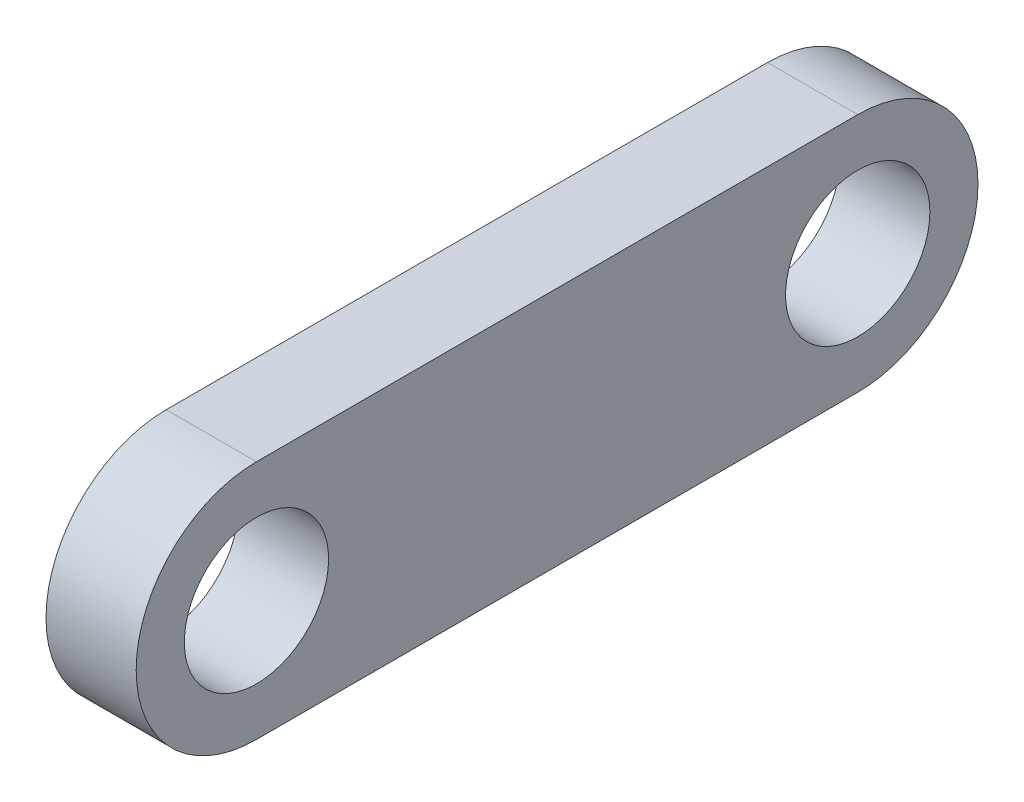
ISO-10303-21;
HEADER;
FILE_DESCRIPTION(('STEP AP214'),'2;1');
FILE_NAME('part.step','',(''),(''),'','','');
FILE_SCHEMA(('AUTOMOTIVE_DESIGN { 1 0 10303 214 1 1 1 1 }'));
ENDSEC;
DATA;
#1=APPLICATION_CONTEXT('core data for automotive mechanical design processes');
#2=APPLICATION_PROTOCOL_DEFINITION('international standard','automotive_design',2000,#1);
#3=PRODUCT_CONTEXT('',#1,'mechanical');
#4=PRODUCT('Part','Part','',(#3));
#5=PRODUCT_RELATED_PRODUCT_CATEGORY('part','',(#4));
#6=PRODUCT_DEFINITION_FORMATION('','',#4);
#7=PRODUCT_DEFINITION_CONTEXT('part definition',#1,'design');
#8=PRODUCT_DEFINITION('design','',#6,#7);
#9=PRODUCT_DEFINITION_SHAPE('','',#8);
#10=(LENGTH_UNIT() NAMED_UNIT(*) SI_UNIT(.MILLI.,.METRE.));
#11=(NAMED_UNIT(*) PLANE_ANGLE_UNIT() SI_UNIT($,.RADIAN.));
#12=(NAMED_UNIT(*) SI_UNIT($,.STERADIAN.) SOLID_ANGLE_UNIT());
#13=UNCERTAINTY_MEASURE_WITH_UNIT(LENGTH_MEASURE(1.E-05),#10,'distance_accuracy_value','');
#14=(GEOMETRIC_REPRESENTATION_CONTEXT(3) GLOBAL_UNCERTAINTY_ASSIGNED_CONTEXT((#13)) GLOBAL_UNIT_ASSIGNED_CONTEXT((#10,
#11,#12)) REPRESENTATION_CONTEXT('',''));
#15=CARTESIAN_POINT('',(0.,0.,0.));
#16=DIRECTION('',(0.,0.,1.));
#17=DIRECTION('',(1.,0.,0.));
#18=AXIS2_PLACEMENT_3D('',#15,#16,#17);
#19=CARTESIAN_POINT('',(-768.375,-128.224072417712,355.133501715319));
#20=DIRECTION('',(1.,0.,0.));
#21=DIRECTION('',(0.,0.,-1.));
#22=AXIS2_PLACEMENT_3D('',#19,#20,#21);
#23=CYLINDRICAL_SURFACE('',#22,20.);
#24=CARTESIAN_POINT('',(-753.375,-128.224072417712,355.133501715319));
#25=DIRECTION('',(1.,0.,0.));
#26=DIRECTION('',(0.,0.,-1.));
#27=AXIS2_PLACEMENT_3D('',#24,#25,#26);
#28=CIRCLE('',#27,20.);
#29=CARTESIAN_POINT('',(-753.375,-108.224072417712,355.133501715319));
#30=VERTEX_POINT('',#29);
#31=CARTESIAN_POINT('',(-753.375,-148.224072417712,355.133501715319));
#32=VERTEX_POINT('',#31);
#33=EDGE_CURVE('E104',#30,#32,#28,.T.);
#34=ORIENTED_EDGE('',*,*,#33,.F.);
#35=DIRECTION('',(1.,0.,0.));
#36=VECTOR('',#35,1.);
#37=CARTESIAN_POINT('',(-768.375,-108.224072417712,355.133501715319));
#38=LINE('',#37,#36);
#39=CARTESIAN_POINT('',(-768.375,-108.224072417712,355.133501715319));
#40=VERTEX_POINT('',#39);
#41=EDGE_CURVE('E11',#40,#30,#38,.T.);
#42=ORIENTED_EDGE('',*,*,#41,.F.);
#43=CARTESIAN_POINT('',(-768.375,-128.224072417712,355.133501715319));
#44=DIRECTION('',(1.,0.,0.));
#45=DIRECTION('',(0.,0.,-1.));
#46=AXIS2_PLACEMENT_3D('',#43,#44,#45);
#47=CIRCLE('',#46,20.);
#48=CARTESIAN_POINT('',(-768.375,-148.224072417712,355.133501715319));
#49=VERTEX_POINT('',#48);
#50=EDGE_CURVE('E97',#40,#49,#47,.T.);
#51=ORIENTED_EDGE('',*,*,#50,.T.);
#52=DIRECTION('',(1.,0.,0.));
#53=VECTOR('',#52,1.);
#54=CARTESIAN_POINT('',(-768.375,-148.224072417712,355.133501715319));
#55=LINE('',#54,#53);
#56=EDGE_CURVE('E42',#49,#32,#55,.T.);
#57=ORIENTED_EDGE('',*,*,#56,.T.);
#58=EDGE_LOOP('',(#34,#42,#51,#57));
#59=FACE_BOUND('',#58,.T.);
#60=ADVANCED_FACE('F39',(#59),#23,.T.);
#61=CARTESIAN_POINT('',(-768.375,-108.224072417712,355.133501715319));
#62=DIRECTION('',(0.,1.,0.));
#63=DIRECTION('',(0.,0.,1.));
#64=AXIS2_PLACEMENT_3D('',#61,#62,#63);
#65=PLANE('',#64);
#66=DIRECTION('',(0.,0.,1.));
#67=VECTOR('',#66,1.);
#68=CARTESIAN_POINT('',(-753.375,-108.224072417712,355.133501715319));
#69=LINE('',#68,#67);
#70=CARTESIAN_POINT('',(-753.375,-108.224072417712,255.133501715319));
#71=VERTEX_POINT('',#70);
#72=EDGE_CURVE('E99',#71,#30,#69,.T.);
#73=ORIENTED_EDGE('',*,*,#72,.F.);
#74=DIRECTION('',(1.,0.,0.));
#75=VECTOR('',#74,1.);
#76=CARTESIAN_POINT('',(-768.375,-108.224072417712,255.133501715319));
#77=LINE('',#76,#75);
#78=CARTESIAN_POINT('',(-768.375,-108.224072417712,255.133501715319));
#79=VERTEX_POINT('',#78);
#80=EDGE_CURVE('E48',#79,#71,#77,.T.);
#81=ORIENTED_EDGE('',*,*,#80,.F.);
#82=DIRECTION('',(0.,0.,1.));
#83=VECTOR('',#82,1.);
#84=CARTESIAN_POINT('',(-768.375,-108.224072417712,355.133501715319));
#85=LINE('',#84,#83);
#86=EDGE_CURVE('E94',#79,#40,#85,.T.);
#87=ORIENTED_EDGE('',*,*,#86,.T.);
#88=ORIENTED_EDGE('',*,*,#41,.T.);
#89=EDGE_LOOP('',(#73,#81,#87,#88));
#90=FACE_BOUND('',#89,.T.);
#91=ADVANCED_FACE('F115',(#90),#65,.T.);
#92=CARTESIAN_POINT('',(-768.375,-128.224072417712,255.133501715319));
#93=DIRECTION('',(1.,0.,0.));
#94=DIRECTION('',(0.,0.,-1.));
#95=AXIS2_PLACEMENT_3D('',#92,#93,#94);
#96=CYLINDRICAL_SURFACE('',#95,20.);
#97=CARTESIAN_POINT('',(-753.375,-128.224072417712,255.133501715319));
#98=DIRECTION('',(1.,0.,0.));
#99=DIRECTION('',(0.,0.,-1.));
#100=AXIS2_PLACEMENT_3D('',#97,#98,#99);
#101=CIRCLE('',#100,20.);
#102=CARTESIAN_POINT('',(-753.375,-148.224072417712,255.133501715319));
#103=VERTEX_POINT('',#102);
#104=EDGE_CURVE('E89',#103,#71,#101,.T.);
#105=ORIENTED_EDGE('',*,*,#104,.F.);
#106=DIRECTION('',(1.,0.,0.));
#107=VECTOR('',#106,1.);
#108=CARTESIAN_POINT('',(-768.375,-148.224072417712,255.133501715319));
#109=LINE('',#108,#107);
#110=CARTESIAN_POINT('',(-768.375,-148.224072417712,255.133501715319));
#111=VERTEX_POINT('',#110);
#112=EDGE_CURVE('E84',#111,#103,#109,.T.);
#113=ORIENTED_EDGE('',*,*,#112,.F.);
#114=CARTESIAN_POINT('',(-768.375,-128.224072417712,255.133501715319));
#115=DIRECTION('',(1.,0.,0.));
#116=DIRECTION('',(0.,0.,-1.));
#117=AXIS2_PLACEMENT_3D('',#114,#115,#116);
#118=CIRCLE('',#117,20.);
#119=EDGE_CURVE('E87',#111,#79,#118,.T.);
#120=ORIENTED_EDGE('',*,*,#119,.T.);
#121=ORIENTED_EDGE('',*,*,#80,.T.);
#122=EDGE_LOOP('',(#105,#113,#120,#121));
#123=FACE_BOUND('',#122,.T.);
#124=ADVANCED_FACE('F86',(#123),#96,.T.);
#125=CARTESIAN_POINT('',(-768.375,-148.224072417712,355.133501715319));
#126=DIRECTION('',(0.,-1.,0.));
#127=DIRECTION('',(0.,0.,-1.));
#128=AXIS2_PLACEMENT_3D('',#125,#126,#127);
#129=PLANE('',#128);
#130=DIRECTION('',(0.,0.,-1.));
#131=VECTOR('',#130,1.);
#132=CARTESIAN_POINT('',(-753.375,-148.224072417712,355.133501715319));
#133=LINE('',#132,#131);
#134=EDGE_CURVE('E107',#32,#103,#133,.T.);
#135=ORIENTED_EDGE('',*,*,#134,.F.);
#136=ORIENTED_EDGE('',*,*,#56,.F.);
#137=DIRECTION('',(0.,0.,-1.));
#138=VECTOR('',#137,1.);
#139=CARTESIAN_POINT('',(-768.375,-148.224072417712,355.133501715319));
#140=LINE('',#139,#138);
#141=EDGE_CURVE('E93',#49,#111,#140,.T.);
#142=ORIENTED_EDGE('',*,*,#141,.T.);
#143=ORIENTED_EDGE('',*,*,#112,.T.);
#144=EDGE_LOOP('',(#135,#136,#142,#143));
#145=FACE_BOUND('',#144,.T.);
#146=ADVANCED_FACE('F96',(#145),#129,.T.);
#147=CARTESIAN_POINT('',(-768.375,-128.224072417712,355.133501715319));
#148=DIRECTION('',(1.,0.,0.));
#149=DIRECTION('',(0.,0.,-1.));
#150=AXIS2_PLACEMENT_3D('',#147,#148,#149);
#151=PLANE('',#150);
#152=CARTESIAN_POINT('',(-768.375,-128.224072417712,355.133501715319));
#153=DIRECTION('',(1.,0.,0.));
#154=DIRECTION('',(0.,0.,-1.));
#155=AXIS2_PLACEMENT_3D('',#152,#153,#154);
#156=CIRCLE('',#155,12.);
#157=CARTESIAN_POINT('',(-768.375,-128.224072417712,343.133501715319));
#158=VERTEX_POINT('',#157);
#159=EDGE_CURVE('E148',#158,#158,#156,.T.);
#160=ORIENTED_EDGE('',*,*,#159,.T.);
#161=EDGE_LOOP('',(#160));
#162=FACE_BOUND('',#161,.T.);
#163=CARTESIAN_POINT('',(-768.375,-128.224072417712,255.133501715319));
#164=DIRECTION('',(1.,0.,0.));
#165=DIRECTION('',(0.,0.,-1.));
#166=AXIS2_PLACEMENT_3D('',#163,#164,#165);
#167=CIRCLE('',#166,12.);
#168=CARTESIAN_POINT('',(-768.375,-128.224072417712,243.133501715318));
#169=VERTEX_POINT('',#168);
#170=EDGE_CURVE('E108',#169,#169,#167,.T.);
#171=ORIENTED_EDGE('',*,*,#170,.T.);
#172=EDGE_LOOP('',(#171));
#173=FACE_BOUND('',#172,.T.);
#174=ORIENTED_EDGE('',*,*,#50,.F.);
#175=ORIENTED_EDGE('',*,*,#86,.F.);
#176=ORIENTED_EDGE('',*,*,#119,.F.);
#177=ORIENTED_EDGE('',*,*,#141,.F.);
#178=EDGE_LOOP('',(#174,#175,#176,#177));
#179=FACE_BOUND('',#178,.T.);
#180=ADVANCED_FACE('F92',(#162,#173,#179),#151,.F.);
#181=CARTESIAN_POINT('',(-753.375,-128.224072417712,355.133501715319));
#182=DIRECTION('',(1.,0.,0.));
#183=DIRECTION('',(0.,0.,-1.));
#184=AXIS2_PLACEMENT_3D('',#181,#182,#183);
#185=PLANE('',#184);
#186=CARTESIAN_POINT('',(-753.375,-128.224072417712,355.133501715319));
#187=DIRECTION('',(1.,0.,0.));
#188=DIRECTION('',(0.,0.,-1.));
#189=AXIS2_PLACEMENT_3D('',#186,#187,#188);
#190=CIRCLE('',#189,12.);
#191=CARTESIAN_POINT('',(-753.375,-128.224072417712,343.133501715319));
#192=VERTEX_POINT('',#191);
#193=EDGE_CURVE('E151',#192,#192,#190,.T.);
#194=ORIENTED_EDGE('',*,*,#193,.F.);
#195=EDGE_LOOP('',(#194));
#196=FACE_BOUND('',#195,.T.);
#197=CARTESIAN_POINT('',(-753.375,-128.224072417712,255.133501715319));
#198=DIRECTION('',(1.,0.,0.));
#199=DIRECTION('',(0.,0.,-1.));
#200=AXIS2_PLACEMENT_3D('',#197,#198,#199);
#201=CIRCLE('',#200,12.);
#202=CARTESIAN_POINT('',(-753.375,-128.224072417712,243.133501715318));
#203=VERTEX_POINT('',#202);
#204=EDGE_CURVE('E153',#203,#203,#201,.T.);
#205=ORIENTED_EDGE('',*,*,#204,.F.);
#206=EDGE_LOOP('',(#205));
#207=FACE_BOUND('',#206,.T.);
#208=ORIENTED_EDGE('',*,*,#33,.T.);
#209=ORIENTED_EDGE('',*,*,#134,.T.);
#210=ORIENTED_EDGE('',*,*,#104,.T.);
#211=ORIENTED_EDGE('',*,*,#72,.T.);
#212=EDGE_LOOP('',(#208,#209,#210,#211));
#213=FACE_BOUND('',#212,.T.);
#214=ADVANCED_FACE('F114',(#196,#207,#213),#185,.T.);
#215=CARTESIAN_POINT('',(-768.375,-128.224072417712,255.133501715319));
#216=DIRECTION('',(1.,0.,0.));
#217=DIRECTION('',(0.,0.,-1.));
#218=AXIS2_PLACEMENT_3D('',#215,#216,#217);
#219=CYLINDRICAL_SURFACE('',#218,12.);
#220=ORIENTED_EDGE('',*,*,#170,.F.);
#221=EDGE_LOOP('',(#220));
#222=FACE_BOUND('',#221,.T.);
#223=ORIENTED_EDGE('',*,*,#204,.T.);
#224=EDGE_LOOP('',(#223));
#225=FACE_BOUND('',#224,.T.);
#226=ADVANCED_FACE('F133',(#222,#225),#219,.F.);
#227=CARTESIAN_POINT('',(-768.375,-128.224072417712,355.133501715319));
#228=DIRECTION('',(1.,0.,0.));
#229=DIRECTION('',(0.,0.,-1.));
#230=AXIS2_PLACEMENT_3D('',#227,#228,#229);
#231=CYLINDRICAL_SURFACE('',#230,12.);
#232=ORIENTED_EDGE('',*,*,#159,.F.);
#233=EDGE_LOOP('',(#232));
#234=FACE_BOUND('',#233,.T.);
#235=ORIENTED_EDGE('',*,*,#193,.T.);
#236=EDGE_LOOP('',(#235));
#237=FACE_BOUND('',#236,.T.);
#238=ADVANCED_FACE('F140',(#234,#237),#231,.F.);
#239=CLOSED_SHELL('',(#60,#91,#124,#146,#180,#214,#226,#238));
#240=MANIFOLD_SOLID_BREP('B2',#239);
#241=ADVANCED_BREP_SHAPE_REPRESENTATION('',(#18,#240),#14);
#242=SHAPE_DEFINITION_REPRESENTATION(#9,#241);
ENDSEC;
END-ISO-10303-21;
